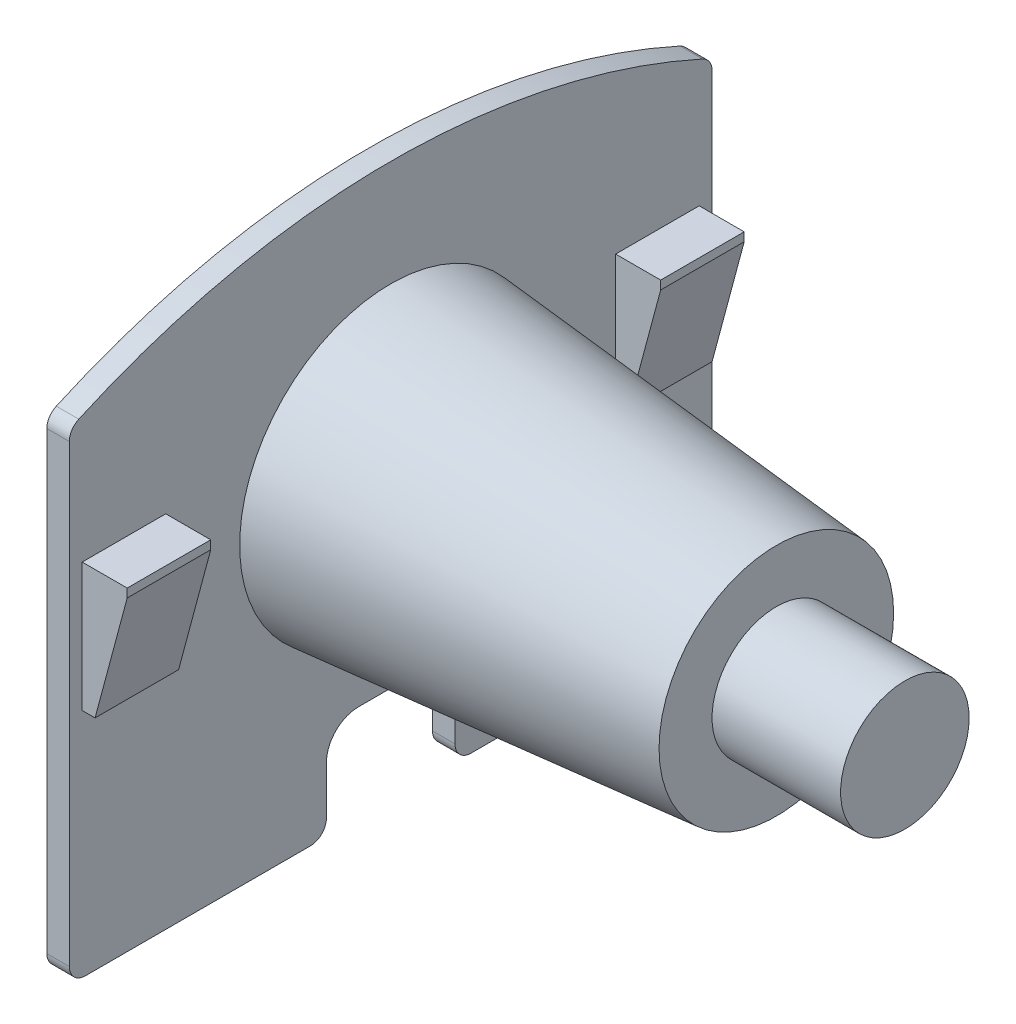
ISO-10303-21;
HEADER;
FILE_DESCRIPTION(('STEP AP214'),'2;1');
FILE_NAME('part.step','',(''),(''),'','','');
FILE_SCHEMA(('AUTOMOTIVE_DESIGN { 1 0 10303 214 1 1 1 1 }'));
ENDSEC;
DATA;
#1=APPLICATION_CONTEXT('core data for automotive mechanical design processes');
#2=APPLICATION_PROTOCOL_DEFINITION('international standard','automotive_design',2000,#1);
#3=PRODUCT_CONTEXT('',#1,'mechanical');
#4=PRODUCT('Part','Part','',(#3));
#5=PRODUCT_RELATED_PRODUCT_CATEGORY('part','',(#4));
#6=PRODUCT_DEFINITION_FORMATION('','',#4);
#7=PRODUCT_DEFINITION_CONTEXT('part definition',#1,'design');
#8=PRODUCT_DEFINITION('design','',#6,#7);
#9=PRODUCT_DEFINITION_SHAPE('','',#8);
#10=(LENGTH_UNIT() NAMED_UNIT(*) SI_UNIT(.MILLI.,.METRE.));
#11=(NAMED_UNIT(*) PLANE_ANGLE_UNIT() SI_UNIT($,.RADIAN.));
#12=(NAMED_UNIT(*) SI_UNIT($,.STERADIAN.) SOLID_ANGLE_UNIT());
#13=UNCERTAINTY_MEASURE_WITH_UNIT(LENGTH_MEASURE(1.E-05),#10,'distance_accuracy_value','');
#14=(GEOMETRIC_REPRESENTATION_CONTEXT(3) GLOBAL_UNCERTAINTY_ASSIGNED_CONTEXT((#13)) GLOBAL_UNIT_ASSIGNED_CONTEXT((#10,
#11,#12)) REPRESENTATION_CONTEXT('',''));
#15=CARTESIAN_POINT('',(0.,0.,0.));
#16=DIRECTION('',(0.,0.,1.));
#17=DIRECTION('',(1.,0.,0.));
#18=AXIS2_PLACEMENT_3D('',#15,#16,#17);
#19=CARTESIAN_POINT('',(6.,0.,0.));
#20=DIRECTION('',(1.,0.,0.));
#21=DIRECTION('',(0.,0.,-1.));
#22=AXIS2_PLACEMENT_3D('',#19,#20,#21);
#23=PLANE('',#22);
#24=CARTESIAN_POINT('',(6.,0.,0.));
#25=DIRECTION('',(1.,0.,0.));
#26=DIRECTION('',(0.,0.,-1.));
#27=AXIS2_PLACEMENT_3D('',#24,#25,#26);
#28=CIRCLE('',#27,1.82506801884446);
#29=CARTESIAN_POINT('',(6.,0.,-1.82506801884446));
#30=VERTEX_POINT('',#29);
#31=EDGE_CURVE('E342',#30,#30,#28,.T.);
#32=ORIENTED_EDGE('',*,*,#31,.T.);
#33=EDGE_LOOP('',(#32));
#34=FACE_BOUND('',#33,.T.);
#35=CARTESIAN_POINT('',(6.,0.,0.));
#36=DIRECTION('',(1.,0.,0.));
#37=DIRECTION('',(0.,0.,-1.));
#38=AXIS2_PLACEMENT_3D('',#35,#36,#37);
#39=CIRCLE('',#38,1.);
#40=CARTESIAN_POINT('',(6.,0.,-1.));
#41=VERTEX_POINT('',#40);
#42=EDGE_CURVE('E43',#41,#41,#39,.F.);
#43=ORIENTED_EDGE('',*,*,#42,.T.);
#44=EDGE_LOOP('',(#43));
#45=FACE_BOUND('',#44,.T.);
#46=ADVANCED_FACE('F39',(#34,#45),#23,.T.);
#47=CARTESIAN_POINT('',(0.,-7.7619550798983,0.));
#48=DIRECTION('',(1.,0.,0.));
#49=DIRECTION('',(0.,0.,-1.));
#50=AXIS2_PLACEMENT_3D('',#47,#48,#49);
#51=PLANE('',#50);
#52=DIRECTION('',(0.,0.,-1.));
#53=VECTOR('',#52,1.);
#54=CARTESIAN_POINT('',(0.,-1.,4.8));
#55=LINE('',#54,#53);
#56=CARTESIAN_POINT('',(0.,-1.,4.8));
#57=VERTEX_POINT('',#56);
#58=CARTESIAN_POINT('',(0.,-1.,3.5));
#59=VERTEX_POINT('',#58);
#60=EDGE_CURVE('E261',#57,#59,#55,.T.);
#61=ORIENTED_EDGE('',*,*,#60,.F.);
#62=DIRECTION('',(0.,-1.,0.));
#63=VECTOR('',#62,1.);
#64=CARTESIAN_POINT('',(0.,0.999999999999999,4.8));
#65=LINE('',#64,#63);
#66=CARTESIAN_POINT('',(0.,0.999999999999999,4.8));
#67=VERTEX_POINT('',#66);
#68=EDGE_CURVE('E256',#67,#57,#65,.T.);
#69=ORIENTED_EDGE('',*,*,#68,.F.);
#70=DIRECTION('',(0.,0.,1.));
#71=VECTOR('',#70,1.);
#72=CARTESIAN_POINT('',(0.,0.999999999999999,4.8));
#73=LINE('',#72,#71);
#74=CARTESIAN_POINT('',(0.,0.999999999999999,3.5));
#75=VERTEX_POINT('',#74);
#76=EDGE_CURVE('E271',#75,#67,#73,.T.);
#77=ORIENTED_EDGE('',*,*,#76,.F.);
#78=DIRECTION('',(0.,1.,0.));
#79=VECTOR('',#78,1.);
#80=CARTESIAN_POINT('',(0.,0.999999999999999,3.5));
#81=LINE('',#80,#79);
#82=EDGE_CURVE('E278',#59,#75,#81,.T.);
#83=ORIENTED_EDGE('',*,*,#82,.F.);
#84=EDGE_LOOP('',(#61,#69,#77,#83));
#85=FACE_BOUND('',#84,.T.);
#86=DIRECTION('',(0.,-1.,0.));
#87=VECTOR('',#86,1.);
#88=CARTESIAN_POINT('',(0.,-4.6,5.));
#89=LINE('',#88,#87);
#90=CARTESIAN_POINT('',(0.,2.72435074062764,5.));
#91=VERTEX_POINT('',#90);
#92=CARTESIAN_POINT('',(0.,-4.35,5.));
#93=VERTEX_POINT('',#92);
#94=EDGE_CURVE('E320',#91,#93,#89,.T.);
#95=ORIENTED_EDGE('',*,*,#94,.T.);
#96=CARTESIAN_POINT('',(0.,-4.35,4.75));
#97=DIRECTION('',(1.,0.,0.));
#98=DIRECTION('',(0.,0.,-1.));
#99=AXIS2_PLACEMENT_3D('',#96,#97,#98);
#100=CIRCLE('',#99,0.25);
#101=CARTESIAN_POINT('',(0.,-4.6,4.75));
#102=VERTEX_POINT('',#101);
#103=EDGE_CURVE('E400',#93,#102,#100,.T.);
#104=ORIENTED_EDGE('',*,*,#103,.T.);
#105=DIRECTION('',(0.,0.,-1.));
#106=VECTOR('',#105,1.);
#107=CARTESIAN_POINT('',(0.,-4.6,5.));
#108=LINE('',#107,#106);
#109=CARTESIAN_POINT('',(0.,-4.6,1.25));
#110=VERTEX_POINT('',#109);
#111=EDGE_CURVE('E323',#102,#110,#108,.T.);
#112=ORIENTED_EDGE('',*,*,#111,.T.);
#113=CARTESIAN_POINT('',(0.,-4.35,1.25));
#114=DIRECTION('',(1.,0.,0.));
#115=DIRECTION('',(0.,0.,-1.));
#116=AXIS2_PLACEMENT_3D('',#113,#114,#115);
#117=CIRCLE('',#116,0.25);
#118=CARTESIAN_POINT('',(0.,-4.35,0.999999999999998));
#119=VERTEX_POINT('',#118);
#120=EDGE_CURVE('E398',#110,#119,#117,.T.);
#121=ORIENTED_EDGE('',*,*,#120,.T.);
#122=DIRECTION('',(0.,1.,0.));
#123=VECTOR('',#122,1.);
#124=CARTESIAN_POINT('',(0.,-4.6,0.999999999999998));
#125=LINE('',#124,#123);
#126=CARTESIAN_POINT('',(0.,-3.6,0.999999999999998));
#127=VERTEX_POINT('',#126);
#128=EDGE_CURVE('E326',#119,#127,#125,.T.);
#129=ORIENTED_EDGE('',*,*,#128,.T.);
#130=CARTESIAN_POINT('',(0.,-3.6,0.499999999999998));
#131=DIRECTION('',(1.,0.,0.));
#132=DIRECTION('',(0.,0.,-1.));
#133=AXIS2_PLACEMENT_3D('',#130,#131,#132);
#134=CIRCLE('',#133,0.5);
#135=CARTESIAN_POINT('',(0.,-3.1,0.499999999999998));
#136=VERTEX_POINT('',#135);
#137=EDGE_CURVE('E379',#127,#136,#134,.F.);
#138=ORIENTED_EDGE('',*,*,#137,.T.);
#139=DIRECTION('',(0.,0.,-1.));
#140=VECTOR('',#139,1.);
#141=CARTESIAN_POINT('',(0.,-3.1,0.999999999999998));
#142=LINE('',#141,#140);
#143=CARTESIAN_POINT('',(0.,-3.1,-0.500000000000002));
#144=VERTEX_POINT('',#143);
#145=EDGE_CURVE('E328',#136,#144,#142,.T.);
#146=ORIENTED_EDGE('',*,*,#145,.T.);
#147=CARTESIAN_POINT('',(0.,-3.6,-0.500000000000002));
#148=DIRECTION('',(1.,0.,0.));
#149=DIRECTION('',(0.,0.,-1.));
#150=AXIS2_PLACEMENT_3D('',#147,#148,#149);
#151=CIRCLE('',#150,0.5);
#152=CARTESIAN_POINT('',(0.,-3.6,-1.));
#153=VERTEX_POINT('',#152);
#154=EDGE_CURVE('E375',#144,#153,#151,.F.);
#155=ORIENTED_EDGE('',*,*,#154,.T.);
#156=DIRECTION('',(0.,-1.,0.));
#157=VECTOR('',#156,1.);
#158=CARTESIAN_POINT('',(0.,-4.6,-1.));
#159=LINE('',#158,#157);
#160=CARTESIAN_POINT('',(0.,-4.35,-1.));
#161=VERTEX_POINT('',#160);
#162=EDGE_CURVE('E331',#153,#161,#159,.T.);
#163=ORIENTED_EDGE('',*,*,#162,.T.);
#164=CARTESIAN_POINT('',(0.,-4.35,-1.25));
#165=DIRECTION('',(1.,0.,0.));
#166=DIRECTION('',(0.,0.,-1.));
#167=AXIS2_PLACEMENT_3D('',#164,#165,#166);
#168=CIRCLE('',#167,0.25);
#169=CARTESIAN_POINT('',(0.,-4.6,-1.25));
#170=VERTEX_POINT('',#169);
#171=EDGE_CURVE('E396',#161,#170,#168,.T.);
#172=ORIENTED_EDGE('',*,*,#171,.T.);
#173=DIRECTION('',(0.,0.,-1.));
#174=VECTOR('',#173,1.);
#175=CARTESIAN_POINT('',(0.,-4.6,-1.));
#176=LINE('',#175,#174);
#177=CARTESIAN_POINT('',(0.,-4.6,-4.75));
#178=VERTEX_POINT('',#177);
#179=EDGE_CURVE('E334',#170,#178,#176,.T.);
#180=ORIENTED_EDGE('',*,*,#179,.T.);
#181=CARTESIAN_POINT('',(0.,-4.35,-4.75));
#182=DIRECTION('',(1.,0.,0.));
#183=DIRECTION('',(0.,0.,-1.));
#184=AXIS2_PLACEMENT_3D('',#181,#182,#183);
#185=CIRCLE('',#184,0.25);
#186=CARTESIAN_POINT('',(0.,-4.35,-5.));
#187=VERTEX_POINT('',#186);
#188=EDGE_CURVE('E394',#178,#187,#185,.T.);
#189=ORIENTED_EDGE('',*,*,#188,.T.);
#190=DIRECTION('',(0.,1.,0.));
#191=VECTOR('',#190,1.);
#192=CARTESIAN_POINT('',(0.,-4.6,-5.));
#193=LINE('',#192,#191);
#194=CARTESIAN_POINT('',(0.,2.72435074062764,-5.));
#195=VERTEX_POINT('',#194);
#196=EDGE_CURVE('E296',#187,#195,#193,.T.);
#197=ORIENTED_EDGE('',*,*,#196,.T.);
#198=CARTESIAN_POINT('',(0.,2.72435074062764,-4.75));
#199=DIRECTION('',(1.,0.,0.));
#200=DIRECTION('',(0.,0.,-1.));
#201=AXIS2_PLACEMENT_3D('',#198,#199,#200);
#202=CIRCLE('',#201,0.25);
#203=CARTESIAN_POINT('',(0.,2.95207717257917,-4.85315363391867));
#204=VERTEX_POINT('',#203);
#205=EDGE_CURVE('E391',#195,#204,#202,.T.);
#206=ORIENTED_EDGE('',*,*,#205,.T.);
#207=CARTESIAN_POINT('',(0.,-7.7619550798983,0.));
#208=DIRECTION('',(1.,0.,0.));
#209=DIRECTION('',(0.,0.,-1.));
#210=AXIS2_PLACEMENT_3D('',#207,#208,#209);
#211=CIRCLE('',#210,11.7619550798983);
#212=CARTESIAN_POINT('',(0.,2.95207717257917,4.85315363391867));
#213=VERTEX_POINT('',#212);
#214=EDGE_CURVE('E290',#204,#213,#211,.T.);
#215=ORIENTED_EDGE('',*,*,#214,.T.);
#216=CARTESIAN_POINT('',(0.,2.72435074062764,4.75));
#217=DIRECTION('',(1.,0.,0.));
#218=DIRECTION('',(0.,0.,-1.));
#219=AXIS2_PLACEMENT_3D('',#216,#217,#218);
#220=CIRCLE('',#219,0.25);
#221=EDGE_CURVE('E389',#213,#91,#220,.T.);
#222=ORIENTED_EDGE('',*,*,#221,.T.);
#223=EDGE_LOOP('',(#95,#104,#112,#121,#129,#138,#146,#155,#163,#172,#180,#189,#197,#206,#215,#222));
#224=FACE_BOUND('',#223,.T.);
#225=CARTESIAN_POINT('',(0.,0.,0.));
#226=DIRECTION('',(1.,0.,0.));
#227=DIRECTION('',(0.,0.,-1.));
#228=AXIS2_PLACEMENT_3D('',#225,#226,#227);
#229=CIRCLE('',#228,2.35);
#230=CARTESIAN_POINT('',(0.,0.,-2.35));
#231=VERTEX_POINT('',#230);
#232=EDGE_CURVE('E316',#231,#231,#229,.T.);
#233=ORIENTED_EDGE('',*,*,#232,.F.);
#234=EDGE_LOOP('',(#233));
#235=FACE_BOUND('',#234,.T.);
#236=DIRECTION('',(0.,-1.,0.));
#237=VECTOR('',#236,1.);
#238=CARTESIAN_POINT('',(0.,0.999999999999998,-3.5));
#239=LINE('',#238,#237);
#240=CARTESIAN_POINT('',(0.,0.999999999999998,-3.5));
#241=VERTEX_POINT('',#240);
#242=CARTESIAN_POINT('',(0.,-1.,-3.5));
#243=VERTEX_POINT('',#242);
#244=EDGE_CURVE('E839',#241,#243,#239,.T.);
#245=ORIENTED_EDGE('',*,*,#244,.F.);
#246=DIRECTION('',(0.,0.,1.));
#247=VECTOR('',#246,1.);
#248=CARTESIAN_POINT('',(0.,0.999999999999998,-4.8));
#249=LINE('',#248,#247);
#250=CARTESIAN_POINT('',(0.,0.999999999999998,-4.8));
#251=VERTEX_POINT('',#250);
#252=EDGE_CURVE('E253',#251,#241,#249,.T.);
#253=ORIENTED_EDGE('',*,*,#252,.F.);
#254=DIRECTION('',(0.,1.,0.));
#255=VECTOR('',#254,1.);
#256=CARTESIAN_POINT('',(0.,0.999999999999998,-4.8));
#257=LINE('',#256,#255);
#258=CARTESIAN_POINT('',(0.,-1.,-4.8));
#259=VERTEX_POINT('',#258);
#260=EDGE_CURVE('E249',#259,#251,#257,.T.);
#261=ORIENTED_EDGE('',*,*,#260,.F.);
#262=DIRECTION('',(0.,0.,-1.));
#263=VECTOR('',#262,1.);
#264=CARTESIAN_POINT('',(0.,-1.,-4.8));
#265=LINE('',#264,#263);
#266=EDGE_CURVE('E828',#243,#259,#265,.T.);
#267=ORIENTED_EDGE('',*,*,#266,.F.);
#268=EDGE_LOOP('',(#245,#253,#261,#267));
#269=FACE_BOUND('',#268,.T.);
#270=ADVANCED_FACE('F440',(#85,#224,#235,#269),#51,.T.);
#271=CARTESIAN_POINT('',(0.,0.,0.));
#272=DIRECTION('',(-1.,0.,0.));
#273=DIRECTION('',(0.,0.,-1.));
#274=AXIS2_PLACEMENT_3D('',#271,#272,#273);
#275=CONICAL_SURFACE('',#274,2.35,0.0872664625997167);
#276=ORIENTED_EDGE('',*,*,#31,.F.);
#277=EDGE_LOOP('',(#276));
#278=FACE_BOUND('',#277,.T.);
#279=ORIENTED_EDGE('',*,*,#232,.T.);
#280=EDGE_LOOP('',(#279));
#281=FACE_BOUND('',#280,.T.);
#282=ADVANCED_FACE('F521',(#278,#281),#275,.T.);
#283=CARTESIAN_POINT('',(-0.35,-4.6,-5.));
#284=DIRECTION('',(0.,0.,-1.));
#285=DIRECTION('',(-1.,0.,0.));
#286=AXIS2_PLACEMENT_3D('',#283,#284,#285);
#287=PLANE('',#286);
#288=ORIENTED_EDGE('',*,*,#196,.F.);
#289=DIRECTION('',(1.,0.,0.));
#290=VECTOR('',#289,1.);
#291=CARTESIAN_POINT('',(-0.35,-4.35,-5.));
#292=LINE('',#291,#290);
#293=CARTESIAN_POINT('',(-0.35,-4.35,-5.));
#294=VERTEX_POINT('',#293);
#295=EDGE_CURVE('E433',#187,#294,#292,.F.);
#296=ORIENTED_EDGE('',*,*,#295,.T.);
#297=DIRECTION('',(0.,1.,0.));
#298=VECTOR('',#297,1.);
#299=CARTESIAN_POINT('',(-0.35,2.49538194882667,-5.));
#300=LINE('',#299,#298);
#301=CARTESIAN_POINT('',(-0.35,2.72435074062764,-5.));
#302=VERTEX_POINT('',#301);
#303=EDGE_CURVE('E291',#294,#302,#300,.T.);
#304=ORIENTED_EDGE('',*,*,#303,.T.);
#305=DIRECTION('',(1.,0.,0.));
#306=VECTOR('',#305,1.);
#307=CARTESIAN_POINT('',(-0.35,2.72435074062764,-5.));
#308=LINE('',#307,#306);
#309=EDGE_CURVE('E429',#302,#195,#308,.T.);
#310=ORIENTED_EDGE('',*,*,#309,.T.);
#311=EDGE_LOOP('',(#288,#296,#304,#310));
#312=FACE_BOUND('',#311,.T.);
#313=ADVANCED_FACE('F449',(#312),#287,.T.);
#314=CARTESIAN_POINT('',(-0.35,-4.6,-1.));
#315=DIRECTION('',(0.,-1.,0.));
#316=DIRECTION('',(0.,0.,-1.));
#317=AXIS2_PLACEMENT_3D('',#314,#315,#316);
#318=PLANE('',#317);
#319=ORIENTED_EDGE('',*,*,#179,.F.);
#320=DIRECTION('',(1.,0.,0.));
#321=VECTOR('',#320,1.);
#322=CARTESIAN_POINT('',(-0.35,-4.6,-1.25));
#323=LINE('',#322,#321);
#324=CARTESIAN_POINT('',(-0.35,-4.6,-1.25));
#325=VERTEX_POINT('',#324);
#326=EDGE_CURVE('E427',#170,#325,#323,.F.);
#327=ORIENTED_EDGE('',*,*,#326,.T.);
#328=DIRECTION('',(0.,0.,-1.));
#329=VECTOR('',#328,1.);
#330=CARTESIAN_POINT('',(-0.35,-4.6,-1.));
#331=LINE('',#330,#329);
#332=CARTESIAN_POINT('',(-0.35,-4.6,-4.75));
#333=VERTEX_POINT('',#332);
#334=EDGE_CURVE('E313',#325,#333,#331,.T.);
#335=ORIENTED_EDGE('',*,*,#334,.T.);
#336=DIRECTION('',(1.,0.,0.));
#337=VECTOR('',#336,1.);
#338=CARTESIAN_POINT('',(-0.35,-4.6,-4.75));
#339=LINE('',#338,#337);
#340=EDGE_CURVE('E424',#333,#178,#339,.T.);
#341=ORIENTED_EDGE('',*,*,#340,.T.);
#342=EDGE_LOOP('',(#319,#327,#335,#341));
#343=FACE_BOUND('',#342,.T.);
#344=ADVANCED_FACE('F461',(#343),#318,.T.);
#345=CARTESIAN_POINT('',(-0.35,-4.6,-1.));
#346=DIRECTION('',(0.,0.,1.));
#347=DIRECTION('',(1.,0.,0.));
#348=AXIS2_PLACEMENT_3D('',#345,#346,#347);
#349=PLANE('',#348);
#350=DIRECTION('',(0.,-1.,0.));
#351=VECTOR('',#350,1.);
#352=CARTESIAN_POINT('',(-0.35,-4.6,-1.));
#353=LINE('',#352,#351);
#354=CARTESIAN_POINT('',(-0.35,-3.6,-1.));
#355=VERTEX_POINT('',#354);
#356=CARTESIAN_POINT('',(-0.35,-4.35,-1.));
#357=VERTEX_POINT('',#356);
#358=EDGE_CURVE('E310',#355,#357,#353,.T.);
#359=ORIENTED_EDGE('',*,*,#358,.T.);
#360=DIRECTION('',(1.,0.,0.));
#361=VECTOR('',#360,1.);
#362=CARTESIAN_POINT('',(-0.35,-4.35,-1.));
#363=LINE('',#362,#361);
#364=EDGE_CURVE('E421',#357,#161,#363,.T.);
#365=ORIENTED_EDGE('',*,*,#364,.T.);
#366=ORIENTED_EDGE('',*,*,#162,.F.);
#367=DIRECTION('',(1.,0.,0.));
#368=VECTOR('',#367,1.);
#369=CARTESIAN_POINT('',(-0.35,-3.6,-1.));
#370=LINE('',#369,#368);
#371=EDGE_CURVE('E370',#153,#355,#370,.F.);
#372=ORIENTED_EDGE('',*,*,#371,.T.);
#373=EDGE_LOOP('',(#359,#365,#366,#372));
#374=FACE_BOUND('',#373,.T.);
#375=ADVANCED_FACE('F469',(#374),#349,.T.);
#376=CARTESIAN_POINT('',(-0.35,-3.1,0.999999999999998));
#377=DIRECTION('',(0.,-1.,0.));
#378=DIRECTION('',(0.,0.,-1.));
#379=AXIS2_PLACEMENT_3D('',#376,#377,#378);
#380=PLANE('',#379);
#381=DIRECTION('',(0.,0.,-1.));
#382=VECTOR('',#381,1.);
#383=CARTESIAN_POINT('',(-0.35,-3.1,0.999999999999998));
#384=LINE('',#383,#382);
#385=CARTESIAN_POINT('',(-0.35,-3.1,0.499999999999998));
#386=VERTEX_POINT('',#385);
#387=CARTESIAN_POINT('',(-0.35,-3.1,-0.500000000000002));
#388=VERTEX_POINT('',#387);
#389=EDGE_CURVE('E307',#386,#388,#384,.T.);
#390=ORIENTED_EDGE('',*,*,#389,.T.);
#391=DIRECTION('',(1.,0.,0.));
#392=VECTOR('',#391,1.);
#393=CARTESIAN_POINT('',(0.,-3.1,-0.500000000000002));
#394=LINE('',#393,#392);
#395=EDGE_CURVE('E367',#388,#144,#394,.T.);
#396=ORIENTED_EDGE('',*,*,#395,.T.);
#397=ORIENTED_EDGE('',*,*,#145,.F.);
#398=DIRECTION('',(1.,0.,0.));
#399=VECTOR('',#398,1.);
#400=CARTESIAN_POINT('',(-0.35,-3.1,0.499999999999998));
#401=LINE('',#400,#399);
#402=EDGE_CURVE('E365',#136,#386,#401,.F.);
#403=ORIENTED_EDGE('',*,*,#402,.T.);
#404=EDGE_LOOP('',(#390,#396,#397,#403));
#405=FACE_BOUND('',#404,.T.);
#406=ADVANCED_FACE('F479',(#405),#380,.T.);
#407=CARTESIAN_POINT('',(-0.35,-4.6,0.999999999999998));
#408=DIRECTION('',(0.,0.,-1.));
#409=DIRECTION('',(-1.,0.,0.));
#410=AXIS2_PLACEMENT_3D('',#407,#408,#409);
#411=PLANE('',#410);
#412=ORIENTED_EDGE('',*,*,#128,.F.);
#413=DIRECTION('',(1.,0.,0.));
#414=VECTOR('',#413,1.);
#415=CARTESIAN_POINT('',(-0.35,-4.35,0.999999999999998));
#416=LINE('',#415,#414);
#417=CARTESIAN_POINT('',(-0.35,-4.35,0.999999999999998));
#418=VERTEX_POINT('',#417);
#419=EDGE_CURVE('E419',#119,#418,#416,.F.);
#420=ORIENTED_EDGE('',*,*,#419,.T.);
#421=DIRECTION('',(0.,1.,0.));
#422=VECTOR('',#421,1.);
#423=CARTESIAN_POINT('',(-0.35,-4.6,0.999999999999998));
#424=LINE('',#423,#422);
#425=CARTESIAN_POINT('',(-0.35,-3.6,0.999999999999998));
#426=VERTEX_POINT('',#425);
#427=EDGE_CURVE('E305',#418,#426,#424,.T.);
#428=ORIENTED_EDGE('',*,*,#427,.T.);
#429=DIRECTION('',(1.,0.,0.));
#430=VECTOR('',#429,1.);
#431=CARTESIAN_POINT('',(0.,-3.6,0.999999999999998));
#432=LINE('',#431,#430);
#433=EDGE_CURVE('E372',#426,#127,#432,.T.);
#434=ORIENTED_EDGE('',*,*,#433,.T.);
#435=EDGE_LOOP('',(#412,#420,#428,#434));
#436=FACE_BOUND('',#435,.T.);
#437=ADVANCED_FACE('F488',(#436),#411,.T.);
#438=CARTESIAN_POINT('',(-0.35,-4.6,5.));
#439=DIRECTION('',(0.,-1.,0.));
#440=DIRECTION('',(0.,0.,-1.));
#441=AXIS2_PLACEMENT_3D('',#438,#439,#440);
#442=PLANE('',#441);
#443=ORIENTED_EDGE('',*,*,#111,.F.);
#444=DIRECTION('',(1.,0.,0.));
#445=VECTOR('',#444,1.);
#446=CARTESIAN_POINT('',(-0.35,-4.6,4.75));
#447=LINE('',#446,#445);
#448=CARTESIAN_POINT('',(-0.35,-4.6,4.75));
#449=VERTEX_POINT('',#448);
#450=EDGE_CURVE('E405',#102,#449,#447,.F.);
#451=ORIENTED_EDGE('',*,*,#450,.T.);
#452=DIRECTION('',(0.,0.,-1.));
#453=VECTOR('',#452,1.);
#454=CARTESIAN_POINT('',(-0.35,-4.6,5.));
#455=LINE('',#454,#453);
#456=CARTESIAN_POINT('',(-0.35,-4.6,1.25));
#457=VERTEX_POINT('',#456);
#458=EDGE_CURVE('E302',#449,#457,#455,.T.);
#459=ORIENTED_EDGE('',*,*,#458,.T.);
#460=DIRECTION('',(1.,0.,0.));
#461=VECTOR('',#460,1.);
#462=CARTESIAN_POINT('',(-0.35,-4.6,1.25));
#463=LINE('',#462,#461);
#464=EDGE_CURVE('E402',#457,#110,#463,.T.);
#465=ORIENTED_EDGE('',*,*,#464,.T.);
#466=EDGE_LOOP('',(#443,#451,#459,#465));
#467=FACE_BOUND('',#466,.T.);
#468=ADVANCED_FACE('F497',(#467),#442,.T.);
#469=CARTESIAN_POINT('',(-0.35,-4.6,5.));
#470=DIRECTION('',(0.,0.,1.));
#471=DIRECTION('',(1.,0.,0.));
#472=AXIS2_PLACEMENT_3D('',#469,#470,#471);
#473=PLANE('',#472);
#474=DIRECTION('',(0.,-1.,0.));
#475=VECTOR('',#474,1.);
#476=CARTESIAN_POINT('',(-0.35,2.49538194882667,5.));
#477=LINE('',#476,#475);
#478=CARTESIAN_POINT('',(-0.35,2.72435074062764,5.));
#479=VERTEX_POINT('',#478);
#480=CARTESIAN_POINT('',(-0.35,-4.35,5.));
#481=VERTEX_POINT('',#480);
#482=EDGE_CURVE('E299',#479,#481,#477,.T.);
#483=ORIENTED_EDGE('',*,*,#482,.T.);
#484=DIRECTION('',(1.,0.,0.));
#485=VECTOR('',#484,1.);
#486=CARTESIAN_POINT('',(-0.35,-4.35,5.));
#487=LINE('',#486,#485);
#488=EDGE_CURVE('E386',#481,#93,#487,.T.);
#489=ORIENTED_EDGE('',*,*,#488,.T.);
#490=ORIENTED_EDGE('',*,*,#94,.F.);
#491=DIRECTION('',(1.,0.,0.));
#492=VECTOR('',#491,1.);
#493=CARTESIAN_POINT('',(-0.35,2.72435074062764,5.));
#494=LINE('',#493,#492);
#495=EDGE_CURVE('E384',#91,#479,#494,.F.);
#496=ORIENTED_EDGE('',*,*,#495,.T.);
#497=EDGE_LOOP('',(#483,#489,#490,#496));
#498=FACE_BOUND('',#497,.T.);
#499=ADVANCED_FACE('F504',(#498),#473,.T.);
#500=CARTESIAN_POINT('',(-0.35,-7.7619550798983,0.));
#501=DIRECTION('',(1.,0.,0.));
#502=DIRECTION('',(0.,0.,-1.));
#503=AXIS2_PLACEMENT_3D('',#500,#501,#502);
#504=CYLINDRICAL_SURFACE('',#503,11.7619550798983);
#505=ORIENTED_EDGE('',*,*,#214,.F.);
#506=DIRECTION('',(1.,0.,0.));
#507=VECTOR('',#506,1.);
#508=CARTESIAN_POINT('',(-0.35,2.95207717257917,-4.85315363391867));
#509=LINE('',#508,#507);
#510=CARTESIAN_POINT('',(-0.35,2.95207717257917,-4.85315363391867));
#511=VERTEX_POINT('',#510);
#512=EDGE_CURVE('E11',#204,#511,#509,.F.);
#513=ORIENTED_EDGE('',*,*,#512,.T.);
#514=CARTESIAN_POINT('',(-0.35,-7.7619550798983,0.));
#515=DIRECTION('',(1.,0.,0.));
#516=DIRECTION('',(0.,0.,-1.));
#517=AXIS2_PLACEMENT_3D('',#514,#515,#516);
#518=CIRCLE('',#517,11.7619550798983);
#519=CARTESIAN_POINT('',(-0.35,2.95207717257917,4.85315363391867));
#520=VERTEX_POINT('',#519);
#521=EDGE_CURVE('E295',#511,#520,#518,.T.);
#522=ORIENTED_EDGE('',*,*,#521,.T.);
#523=DIRECTION('',(1.,0.,0.));
#524=VECTOR('',#523,1.);
#525=CARTESIAN_POINT('',(-0.35,2.95207717257917,4.85315363391867));
#526=LINE('',#525,#524);
#527=EDGE_CURVE('E49',#520,#213,#526,.T.);
#528=ORIENTED_EDGE('',*,*,#527,.T.);
#529=EDGE_LOOP('',(#505,#513,#522,#528));
#530=FACE_BOUND('',#529,.T.);
#531=ADVANCED_FACE('F437',(#530),#504,.T.);
#532=CARTESIAN_POINT('',(-0.35,-7.7619550798983,0.));
#533=DIRECTION('',(1.,0.,0.));
#534=DIRECTION('',(0.,0.,-1.));
#535=AXIS2_PLACEMENT_3D('',#532,#533,#534);
#536=PLANE('',#535);
#537=ORIENTED_EDGE('',*,*,#458,.F.);
#538=CARTESIAN_POINT('',(-0.35,-4.35,4.75));
#539=DIRECTION('',(1.,0.,0.));
#540=DIRECTION('',(0.,0.,-1.));
#541=AXIS2_PLACEMENT_3D('',#538,#539,#540);
#542=CIRCLE('',#541,0.25);
#543=EDGE_CURVE('E417',#449,#481,#542,.F.);
#544=ORIENTED_EDGE('',*,*,#543,.T.);
#545=ORIENTED_EDGE('',*,*,#482,.F.);
#546=CARTESIAN_POINT('',(-0.35,2.72435074062764,4.75));
#547=DIRECTION('',(1.,0.,0.));
#548=DIRECTION('',(0.,0.,-1.));
#549=AXIS2_PLACEMENT_3D('',#546,#547,#548);
#550=CIRCLE('',#549,0.25);
#551=EDGE_CURVE('E56',#479,#520,#550,.F.);
#552=ORIENTED_EDGE('',*,*,#551,.T.);
#553=ORIENTED_EDGE('',*,*,#521,.F.);
#554=CARTESIAN_POINT('',(-0.35,2.72435074062764,-4.75));
#555=DIRECTION('',(1.,0.,0.));
#556=DIRECTION('',(0.,0.,-1.));
#557=AXIS2_PLACEMENT_3D('',#554,#555,#556);
#558=CIRCLE('',#557,0.25);
#559=EDGE_CURVE('E408',#511,#302,#558,.F.);
#560=ORIENTED_EDGE('',*,*,#559,.T.);
#561=ORIENTED_EDGE('',*,*,#303,.F.);
#562=CARTESIAN_POINT('',(-0.35,-4.35,-4.75));
#563=DIRECTION('',(1.,0.,0.));
#564=DIRECTION('',(0.,0.,-1.));
#565=AXIS2_PLACEMENT_3D('',#562,#563,#564);
#566=CIRCLE('',#565,0.25);
#567=EDGE_CURVE('E411',#294,#333,#566,.F.);
#568=ORIENTED_EDGE('',*,*,#567,.T.);
#569=ORIENTED_EDGE('',*,*,#334,.F.);
#570=CARTESIAN_POINT('',(-0.35,-4.35,-1.25));
#571=DIRECTION('',(1.,0.,0.));
#572=DIRECTION('',(0.,0.,-1.));
#573=AXIS2_PLACEMENT_3D('',#570,#571,#572);
#574=CIRCLE('',#573,0.25);
#575=EDGE_CURVE('E413',#325,#357,#574,.F.);
#576=ORIENTED_EDGE('',*,*,#575,.T.);
#577=ORIENTED_EDGE('',*,*,#358,.F.);
#578=CARTESIAN_POINT('',(-0.35,-3.6,-0.500000000000002));
#579=DIRECTION('',(1.,0.,0.));
#580=DIRECTION('',(0.,0.,-1.));
#581=AXIS2_PLACEMENT_3D('',#578,#579,#580);
#582=CIRCLE('',#581,0.5);
#583=EDGE_CURVE('E377',#355,#388,#582,.T.);
#584=ORIENTED_EDGE('',*,*,#583,.T.);
#585=ORIENTED_EDGE('',*,*,#389,.F.);
#586=CARTESIAN_POINT('',(-0.35,-3.6,0.499999999999998));
#587=DIRECTION('',(1.,0.,0.));
#588=DIRECTION('',(0.,0.,-1.));
#589=AXIS2_PLACEMENT_3D('',#586,#587,#588);
#590=CIRCLE('',#589,0.5);
#591=EDGE_CURVE('E381',#386,#426,#590,.T.);
#592=ORIENTED_EDGE('',*,*,#591,.T.);
#593=ORIENTED_EDGE('',*,*,#427,.F.);
#594=CARTESIAN_POINT('',(-0.35,-4.35,1.25));
#595=DIRECTION('',(1.,0.,0.));
#596=DIRECTION('',(0.,0.,-1.));
#597=AXIS2_PLACEMENT_3D('',#594,#595,#596);
#598=CIRCLE('',#597,0.25);
#599=EDGE_CURVE('E415',#418,#457,#598,.F.);
#600=ORIENTED_EDGE('',*,*,#599,.T.);
#601=EDGE_LOOP('',(#537,#544,#545,#552,#553,#560,#561,#568,#569,#576,#577,#584,#585,#592,#593,#600));
#602=FACE_BOUND('',#601,.T.);
#603=ADVANCED_FACE('F454',(#602),#536,.F.);
#604=CARTESIAN_POINT('',(0.7,0.999999999999999,4.8));
#605=DIRECTION('',(0.,0.,-1.));
#606=DIRECTION('',(-1.,0.,0.));
#607=AXIS2_PLACEMENT_3D('',#604,#605,#606);
#608=PLANE('',#607);
#609=DIRECTION('',(-1.,0.,0.));
#610=VECTOR('',#609,1.);
#611=CARTESIAN_POINT('',(0.7,-1.,4.8));
#612=LINE('',#611,#610);
#613=CARTESIAN_POINT('',(0.199999999999999,-1.,4.8));
#614=VERTEX_POINT('',#613);
#615=EDGE_CURVE('E288',#614,#57,#612,.T.);
#616=ORIENTED_EDGE('',*,*,#615,.F.);
#617=DIRECTION('',(0.258819045102521,0.965925826289068,0.));
#618=VECTOR('',#617,1.);
#619=CARTESIAN_POINT('',(0.7,0.866025403784436,4.8));
#620=LINE('',#619,#618);
#621=CARTESIAN_POINT('',(0.7,0.866025403784436,4.8));
#622=VERTEX_POINT('',#621);
#623=EDGE_CURVE('E363',#614,#622,#620,.T.);
#624=ORIENTED_EDGE('',*,*,#623,.T.);
#625=DIRECTION('',(0.,-1.,0.));
#626=VECTOR('',#625,1.);
#627=CARTESIAN_POINT('',(0.7,0.999999999999999,4.8));
#628=LINE('',#627,#626);
#629=CARTESIAN_POINT('',(0.7,0.999999999999999,4.8));
#630=VERTEX_POINT('',#629);
#631=EDGE_CURVE('E267',#630,#622,#628,.T.);
#632=ORIENTED_EDGE('',*,*,#631,.F.);
#633=DIRECTION('',(-1.,0.,0.));
#634=VECTOR('',#633,1.);
#635=CARTESIAN_POINT('',(0.7,0.999999999999999,4.8));
#636=LINE('',#635,#634);
#637=EDGE_CURVE('E274',#630,#67,#636,.T.);
#638=ORIENTED_EDGE('',*,*,#637,.T.);
#639=ORIENTED_EDGE('',*,*,#68,.T.);
#640=EDGE_LOOP('',(#616,#624,#632,#638,#639));
#641=FACE_BOUND('',#640,.T.);
#642=ADVANCED_FACE('F616',(#641),#608,.F.);
#643=CARTESIAN_POINT('',(0.7,-1.,4.8));
#644=DIRECTION('',(0.,1.,0.));
#645=DIRECTION('',(0.,0.,1.));
#646=AXIS2_PLACEMENT_3D('',#643,#644,#645);
#647=PLANE('',#646);
#648=DIRECTION('',(-1.,0.,0.));
#649=VECTOR('',#648,1.);
#650=CARTESIAN_POINT('',(0.7,-1.,3.5));
#651=LINE('',#650,#649);
#652=CARTESIAN_POINT('',(0.199999999999999,-1.,3.5));
#653=VERTEX_POINT('',#652);
#654=EDGE_CURVE('E286',#653,#59,#651,.T.);
#655=ORIENTED_EDGE('',*,*,#654,.F.);
#656=DIRECTION('',(0.,0.,1.));
#657=VECTOR('',#656,1.);
#658=CARTESIAN_POINT('',(0.199999999999999,-1.,4.8));
#659=LINE('',#658,#657);
#660=EDGE_CURVE('E361',#653,#614,#659,.T.);
#661=ORIENTED_EDGE('',*,*,#660,.T.);
#662=ORIENTED_EDGE('',*,*,#615,.T.);
#663=ORIENTED_EDGE('',*,*,#60,.T.);
#664=EDGE_LOOP('',(#655,#661,#662,#663));
#665=FACE_BOUND('',#664,.T.);
#666=ADVANCED_FACE('F612',(#665),#647,.F.);
#667=CARTESIAN_POINT('',(0.7,0.999999999999999,3.5));
#668=DIRECTION('',(0.,0.,1.));
#669=DIRECTION('',(0.,-1.,0.));
#670=AXIS2_PLACEMENT_3D('',#667,#668,#669);
#671=PLANE('',#670);
#672=DIRECTION('',(0.,1.,0.));
#673=VECTOR('',#672,1.);
#674=CARTESIAN_POINT('',(0.7,0.999999999999999,3.5));
#675=LINE('',#674,#673);
#676=CARTESIAN_POINT('',(0.7,0.866025403784436,3.5));
#677=VERTEX_POINT('',#676);
#678=CARTESIAN_POINT('',(0.7,0.999999999999999,3.5));
#679=VERTEX_POINT('',#678);
#680=EDGE_CURVE('E270',#677,#679,#675,.T.);
#681=ORIENTED_EDGE('',*,*,#680,.F.);
#682=DIRECTION('',(-0.258819045102521,-0.965925826289068,0.));
#683=VECTOR('',#682,1.);
#684=CARTESIAN_POINT('',(0.7,0.866025403784436,3.5));
#685=LINE('',#684,#683);
#686=EDGE_CURVE('E359',#677,#653,#685,.T.);
#687=ORIENTED_EDGE('',*,*,#686,.T.);
#688=ORIENTED_EDGE('',*,*,#654,.T.);
#689=ORIENTED_EDGE('',*,*,#82,.T.);
#690=DIRECTION('',(-1.,0.,0.));
#691=VECTOR('',#690,1.);
#692=CARTESIAN_POINT('',(0.7,0.999999999999999,3.5));
#693=LINE('',#692,#691);
#694=EDGE_CURVE('E284',#679,#75,#693,.T.);
#695=ORIENTED_EDGE('',*,*,#694,.F.);
#696=EDGE_LOOP('',(#681,#687,#688,#689,#695));
#697=FACE_BOUND('',#696,.T.);
#698=ADVANCED_FACE('F608',(#697),#671,.F.);
#699=CARTESIAN_POINT('',(0.7,0.999999999999999,4.8));
#700=DIRECTION('',(0.,-1.,0.));
#701=DIRECTION('',(0.,0.,-1.));
#702=AXIS2_PLACEMENT_3D('',#699,#700,#701);
#703=PLANE('',#702);
#704=ORIENTED_EDGE('',*,*,#76,.T.);
#705=ORIENTED_EDGE('',*,*,#637,.F.);
#706=DIRECTION('',(0.,0.,1.));
#707=VECTOR('',#706,1.);
#708=CARTESIAN_POINT('',(0.7,0.999999999999999,4.8));
#709=LINE('',#708,#707);
#710=EDGE_CURVE('E273',#679,#630,#709,.T.);
#711=ORIENTED_EDGE('',*,*,#710,.F.);
#712=ORIENTED_EDGE('',*,*,#694,.T.);
#713=EDGE_LOOP('',(#704,#705,#711,#712));
#714=FACE_BOUND('',#713,.T.);
#715=ADVANCED_FACE('F604',(#714),#703,.F.);
#716=CARTESIAN_POINT('',(0.7,0.,0.));
#717=DIRECTION('',(1.,0.,0.));
#718=DIRECTION('',(0.,0.,-1.));
#719=AXIS2_PLACEMENT_3D('',#716,#717,#718);
#720=PLANE('',#719);
#721=ORIENTED_EDGE('',*,*,#631,.T.);
#722=DIRECTION('',(0.,0.,-1.));
#723=VECTOR('',#722,1.);
#724=CARTESIAN_POINT('',(0.7,0.866025403784436,3.5));
#725=LINE('',#724,#723);
#726=EDGE_CURVE('E356',#622,#677,#725,.T.);
#727=ORIENTED_EDGE('',*,*,#726,.T.);
#728=ORIENTED_EDGE('',*,*,#680,.T.);
#729=ORIENTED_EDGE('',*,*,#710,.T.);
#730=EDGE_LOOP('',(#721,#727,#728,#729));
#731=FACE_BOUND('',#730,.T.);
#732=ADVANCED_FACE('F601',(#731),#720,.T.);
#733=CARTESIAN_POINT('',(0.7,0.999999999999998,-4.8));
#734=DIRECTION('',(0.,-1.,0.));
#735=DIRECTION('',(0.,0.,-1.));
#736=AXIS2_PLACEMENT_3D('',#733,#734,#735);
#737=PLANE('',#736);
#738=ORIENTED_EDGE('',*,*,#252,.T.);
#739=DIRECTION('',(-1.,0.,0.));
#740=VECTOR('',#739,1.);
#741=CARTESIAN_POINT('',(0.7,0.999999999999998,-3.5));
#742=LINE('',#741,#740);
#743=CARTESIAN_POINT('',(0.7,0.999999999999998,-3.5));
#744=VERTEX_POINT('',#743);
#745=EDGE_CURVE('E231',#744,#241,#742,.T.);
#746=ORIENTED_EDGE('',*,*,#745,.F.);
#747=DIRECTION('',(0.,0.,1.));
#748=VECTOR('',#747,1.);
#749=CARTESIAN_POINT('',(0.7,0.999999999999998,-4.8));
#750=LINE('',#749,#748);
#751=CARTESIAN_POINT('',(0.7,0.999999999999998,-4.8));
#752=VERTEX_POINT('',#751);
#753=EDGE_CURVE('E240',#752,#744,#750,.T.);
#754=ORIENTED_EDGE('',*,*,#753,.F.);
#755=DIRECTION('',(-1.,0.,0.));
#756=VECTOR('',#755,1.);
#757=CARTESIAN_POINT('',(0.7,0.999999999999998,-4.8));
#758=LINE('',#757,#756);
#759=EDGE_CURVE('E831',#752,#251,#758,.T.);
#760=ORIENTED_EDGE('',*,*,#759,.T.);
#761=EDGE_LOOP('',(#738,#746,#754,#760));
#762=FACE_BOUND('',#761,.T.);
#763=ADVANCED_FACE('F251',(#762),#737,.F.);
#764=CARTESIAN_POINT('',(0.7,0.999999999999998,-3.5));
#765=DIRECTION('',(0.,0.,-1.));
#766=DIRECTION('',(0.,1.,0.));
#767=AXIS2_PLACEMENT_3D('',#764,#765,#766);
#768=PLANE('',#767);
#769=DIRECTION('',(-1.,0.,0.));
#770=VECTOR('',#769,1.);
#771=CARTESIAN_POINT('',(0.7,-1.,-3.5));
#772=LINE('',#771,#770);
#773=CARTESIAN_POINT('',(0.199999999999999,-1.,-3.5));
#774=VERTEX_POINT('',#773);
#775=EDGE_CURVE('E257',#774,#243,#772,.T.);
#776=ORIENTED_EDGE('',*,*,#775,.F.);
#777=DIRECTION('',(0.258819045102521,0.965925826289068,0.));
#778=VECTOR('',#777,1.);
#779=CARTESIAN_POINT('',(0.7,0.866025403784436,-3.5));
#780=LINE('',#779,#778);
#781=CARTESIAN_POINT('',(0.7,0.866025403784437,-3.5));
#782=VERTEX_POINT('',#781);
#783=EDGE_CURVE('E234',#774,#782,#780,.T.);
#784=ORIENTED_EDGE('',*,*,#783,.T.);
#785=DIRECTION('',(0.,-1.,0.));
#786=VECTOR('',#785,1.);
#787=CARTESIAN_POINT('',(0.7,0.999999999999998,-3.5));
#788=LINE('',#787,#786);
#789=EDGE_CURVE('E225',#744,#782,#788,.T.);
#790=ORIENTED_EDGE('',*,*,#789,.F.);
#791=ORIENTED_EDGE('',*,*,#745,.T.);
#792=ORIENTED_EDGE('',*,*,#244,.T.);
#793=EDGE_LOOP('',(#776,#784,#790,#791,#792));
#794=FACE_BOUND('',#793,.T.);
#795=ADVANCED_FACE('F228',(#794),#768,.F.);
#796=CARTESIAN_POINT('',(0.7,-1.,-4.8));
#797=DIRECTION('',(0.,1.,0.));
#798=DIRECTION('',(0.,0.,1.));
#799=AXIS2_PLACEMENT_3D('',#796,#797,#798);
#800=PLANE('',#799);
#801=DIRECTION('',(-1.,0.,0.));
#802=VECTOR('',#801,1.);
#803=CARTESIAN_POINT('',(0.7,-1.,-4.8));
#804=LINE('',#803,#802);
#805=CARTESIAN_POINT('',(0.199999999999999,-1.,-4.8));
#806=VERTEX_POINT('',#805);
#807=EDGE_CURVE('E263',#806,#259,#804,.T.);
#808=ORIENTED_EDGE('',*,*,#807,.F.);
#809=DIRECTION('',(0.,0.,1.));
#810=VECTOR('',#809,1.);
#811=CARTESIAN_POINT('',(0.199999999999999,-1.,-3.5));
#812=LINE('',#811,#810);
#813=EDGE_CURVE('E352',#806,#774,#812,.T.);
#814=ORIENTED_EDGE('',*,*,#813,.T.);
#815=ORIENTED_EDGE('',*,*,#775,.T.);
#816=ORIENTED_EDGE('',*,*,#266,.T.);
#817=EDGE_LOOP('',(#808,#814,#815,#816));
#818=FACE_BOUND('',#817,.T.);
#819=ADVANCED_FACE('F592',(#818),#800,.F.);
#820=CARTESIAN_POINT('',(0.7,0.999999999999998,-4.8));
#821=DIRECTION('',(0.,0.,1.));
#822=DIRECTION('',(1.,0.,0.));
#823=AXIS2_PLACEMENT_3D('',#820,#821,#822);
#824=PLANE('',#823);
#825=DIRECTION('',(0.,1.,0.));
#826=VECTOR('',#825,1.);
#827=CARTESIAN_POINT('',(0.7,0.999999999999998,-4.8));
#828=LINE('',#827,#826);
#829=CARTESIAN_POINT('',(0.7,0.866025403784437,-4.8));
#830=VERTEX_POINT('',#829);
#831=EDGE_CURVE('E239',#830,#752,#828,.T.);
#832=ORIENTED_EDGE('',*,*,#831,.F.);
#833=DIRECTION('',(-0.258819045102521,-0.965925826289068,0.));
#834=VECTOR('',#833,1.);
#835=CARTESIAN_POINT('',(0.7,0.866025403784437,-4.8));
#836=LINE('',#835,#834);
#837=EDGE_CURVE('E349',#830,#806,#836,.T.);
#838=ORIENTED_EDGE('',*,*,#837,.T.);
#839=ORIENTED_EDGE('',*,*,#807,.T.);
#840=ORIENTED_EDGE('',*,*,#260,.T.);
#841=ORIENTED_EDGE('',*,*,#759,.F.);
#842=EDGE_LOOP('',(#832,#838,#839,#840,#841));
#843=FACE_BOUND('',#842,.T.);
#844=ADVANCED_FACE('F589',(#843),#824,.F.);
#845=CARTESIAN_POINT('',(0.7,0.,0.));
#846=DIRECTION('',(1.,0.,0.));
#847=DIRECTION('',(0.,0.,-1.));
#848=AXIS2_PLACEMENT_3D('',#845,#846,#847);
#849=PLANE('',#848);
#850=ORIENTED_EDGE('',*,*,#789,.T.);
#851=DIRECTION('',(0.,0.,-1.));
#852=VECTOR('',#851,1.);
#853=CARTESIAN_POINT('',(0.7,0.866025403784436,-4.8));
#854=LINE('',#853,#852);
#855=EDGE_CURVE('E346',#782,#830,#854,.T.);
#856=ORIENTED_EDGE('',*,*,#855,.T.);
#857=ORIENTED_EDGE('',*,*,#831,.T.);
#858=ORIENTED_EDGE('',*,*,#753,.T.);
#859=EDGE_LOOP('',(#850,#856,#857,#858));
#860=FACE_BOUND('',#859,.T.);
#861=ADVANCED_FACE('F243',(#860),#849,.T.);
#862=CARTESIAN_POINT('',(0.7,0.866025403784437,0.));
#863=DIRECTION('',(0.965925826289068,-0.258819045102521,0.));
#864=DIRECTION('',(0.,0.,1.));
#865=AXIS2_PLACEMENT_3D('',#862,#863,#864);
#866=PLANE('',#865);
#867=ORIENTED_EDGE('',*,*,#783,.F.);
#868=ORIENTED_EDGE('',*,*,#813,.F.);
#869=ORIENTED_EDGE('',*,*,#837,.F.);
#870=ORIENTED_EDGE('',*,*,#855,.F.);
#871=EDGE_LOOP('',(#867,#868,#869,#870));
#872=FACE_BOUND('',#871,.T.);
#873=ADVANCED_FACE('F531',(#872),#866,.T.);
#874=CARTESIAN_POINT('',(0.7,0.866025403784436,0.));
#875=DIRECTION('',(0.965925826289068,-0.258819045102521,0.));
#876=DIRECTION('',(0.,0.,1.));
#877=AXIS2_PLACEMENT_3D('',#874,#875,#876);
#878=PLANE('',#877);
#879=ORIENTED_EDGE('',*,*,#623,.F.);
#880=ORIENTED_EDGE('',*,*,#660,.F.);
#881=ORIENTED_EDGE('',*,*,#686,.F.);
#882=ORIENTED_EDGE('',*,*,#726,.F.);
#883=EDGE_LOOP('',(#879,#880,#881,#882));
#884=FACE_BOUND('',#883,.T.);
#885=ADVANCED_FACE('F534',(#884),#878,.T.);
#886=CARTESIAN_POINT('',(-0.35,-3.6,-0.500000000000002));
#887=DIRECTION('',(-1.,0.,0.));
#888=DIRECTION('',(0.,0.,1.));
#889=AXIS2_PLACEMENT_3D('',#886,#887,#888);
#890=CYLINDRICAL_SURFACE('',#889,0.5);
#891=ORIENTED_EDGE('',*,*,#583,.F.);
#892=ORIENTED_EDGE('',*,*,#371,.F.);
#893=ORIENTED_EDGE('',*,*,#154,.F.);
#894=ORIENTED_EDGE('',*,*,#395,.F.);
#895=EDGE_LOOP('',(#891,#892,#893,#894));
#896=FACE_BOUND('',#895,.T.);
#897=ADVANCED_FACE('F476',(#896),#890,.F.);
#898=CARTESIAN_POINT('',(-0.35,-3.6,0.499999999999998));
#899=DIRECTION('',(-1.,0.,0.));
#900=DIRECTION('',(0.,0.,1.));
#901=AXIS2_PLACEMENT_3D('',#898,#899,#900);
#902=CYLINDRICAL_SURFACE('',#901,0.5);
#903=ORIENTED_EDGE('',*,*,#591,.F.);
#904=ORIENTED_EDGE('',*,*,#402,.F.);
#905=ORIENTED_EDGE('',*,*,#137,.F.);
#906=ORIENTED_EDGE('',*,*,#433,.F.);
#907=EDGE_LOOP('',(#903,#904,#905,#906));
#908=FACE_BOUND('',#907,.T.);
#909=ADVANCED_FACE('F486',(#908),#902,.F.);
#910=CARTESIAN_POINT('',(-0.35,-4.35,4.75));
#911=DIRECTION('',(1.,0.,0.));
#912=DIRECTION('',(0.,0.,-1.));
#913=AXIS2_PLACEMENT_3D('',#910,#911,#912);
#914=CYLINDRICAL_SURFACE('',#913,0.25);
#915=ORIENTED_EDGE('',*,*,#543,.F.);
#916=ORIENTED_EDGE('',*,*,#450,.F.);
#917=ORIENTED_EDGE('',*,*,#103,.F.);
#918=ORIENTED_EDGE('',*,*,#488,.F.);
#919=EDGE_LOOP('',(#915,#916,#917,#918));
#920=FACE_BOUND('',#919,.T.);
#921=ADVANCED_FACE('F502',(#920),#914,.T.);
#922=CARTESIAN_POINT('',(-0.35,-4.35,1.25));
#923=DIRECTION('',(1.,0.,0.));
#924=DIRECTION('',(0.,0.,-1.));
#925=AXIS2_PLACEMENT_3D('',#922,#923,#924);
#926=CYLINDRICAL_SURFACE('',#925,0.25);
#927=ORIENTED_EDGE('',*,*,#599,.F.);
#928=ORIENTED_EDGE('',*,*,#419,.F.);
#929=ORIENTED_EDGE('',*,*,#120,.F.);
#930=ORIENTED_EDGE('',*,*,#464,.F.);
#931=EDGE_LOOP('',(#927,#928,#929,#930));
#932=FACE_BOUND('',#931,.T.);
#933=ADVANCED_FACE('F494',(#932),#926,.T.);
#934=CARTESIAN_POINT('',(-0.35,-4.35,-1.25));
#935=DIRECTION('',(1.,0.,0.));
#936=DIRECTION('',(0.,0.,-1.));
#937=AXIS2_PLACEMENT_3D('',#934,#935,#936);
#938=CYLINDRICAL_SURFACE('',#937,0.25);
#939=ORIENTED_EDGE('',*,*,#575,.F.);
#940=ORIENTED_EDGE('',*,*,#326,.F.);
#941=ORIENTED_EDGE('',*,*,#171,.F.);
#942=ORIENTED_EDGE('',*,*,#364,.F.);
#943=EDGE_LOOP('',(#939,#940,#941,#942));
#944=FACE_BOUND('',#943,.T.);
#945=ADVANCED_FACE('F467',(#944),#938,.T.);
#946=CARTESIAN_POINT('',(-0.35,-4.35,-4.75));
#947=DIRECTION('',(1.,0.,0.));
#948=DIRECTION('',(0.,0.,-1.));
#949=AXIS2_PLACEMENT_3D('',#946,#947,#948);
#950=CYLINDRICAL_SURFACE('',#949,0.25);
#951=ORIENTED_EDGE('',*,*,#567,.F.);
#952=ORIENTED_EDGE('',*,*,#295,.F.);
#953=ORIENTED_EDGE('',*,*,#188,.F.);
#954=ORIENTED_EDGE('',*,*,#340,.F.);
#955=EDGE_LOOP('',(#951,#952,#953,#954));
#956=FACE_BOUND('',#955,.T.);
#957=ADVANCED_FACE('F458',(#956),#950,.T.);
#958=CARTESIAN_POINT('',(-0.35,2.72435074062764,-4.75));
#959=DIRECTION('',(1.,0.,0.));
#960=DIRECTION('',(0.,0.,-1.));
#961=AXIS2_PLACEMENT_3D('',#958,#959,#960);
#962=CYLINDRICAL_SURFACE('',#961,0.25);
#963=ORIENTED_EDGE('',*,*,#559,.F.);
#964=ORIENTED_EDGE('',*,*,#512,.F.);
#965=ORIENTED_EDGE('',*,*,#205,.F.);
#966=ORIENTED_EDGE('',*,*,#309,.F.);
#967=EDGE_LOOP('',(#963,#964,#965,#966));
#968=FACE_BOUND('',#967,.T.);
#969=ADVANCED_FACE('F447',(#968),#962,.T.);
#970=CARTESIAN_POINT('',(-0.35,2.72435074062764,4.75));
#971=DIRECTION('',(1.,0.,0.));
#972=DIRECTION('',(0.,0.,-1.));
#973=AXIS2_PLACEMENT_3D('',#970,#971,#972);
#974=CYLINDRICAL_SURFACE('',#973,0.25);
#975=ORIENTED_EDGE('',*,*,#551,.F.);
#976=ORIENTED_EDGE('',*,*,#495,.F.);
#977=ORIENTED_EDGE('',*,*,#221,.F.);
#978=ORIENTED_EDGE('',*,*,#527,.F.);
#979=EDGE_LOOP('',(#975,#976,#977,#978));
#980=FACE_BOUND('',#979,.T.);
#981=ADVANCED_FACE('F41',(#980),#974,.T.);
#982=CARTESIAN_POINT('',(8.,0.,0.));
#983=DIRECTION('',(-1.,0.,0.));
#984=DIRECTION('',(0.,0.,1.));
#985=AXIS2_PLACEMENT_3D('',#982,#983,#984);
#986=CYLINDRICAL_SURFACE('',#985,1.);
#987=ORIENTED_EDGE('',*,*,#42,.F.);
#988=EDGE_LOOP('',(#987));
#989=FACE_BOUND('',#988,.T.);
#990=CARTESIAN_POINT('',(8.,0.,0.));
#991=DIRECTION('',(1.,0.,0.));
#992=DIRECTION('',(0.,0.,-1.));
#993=AXIS2_PLACEMENT_3D('',#990,#991,#992);
#994=CIRCLE('',#993,1.);
#995=CARTESIAN_POINT('',(8.,0.,-1.));
#996=VERTEX_POINT('',#995);
#997=EDGE_CURVE('E847',#996,#996,#994,.T.);
#998=ORIENTED_EDGE('',*,*,#997,.F.);
#999=EDGE_LOOP('',(#998));
#1000=FACE_BOUND('',#999,.T.);
#1001=ADVANCED_FACE('F507',(#989,#1000),#986,.T.);
#1002=CARTESIAN_POINT('',(8.,0.,0.));
#1003=DIRECTION('',(1.,0.,0.));
#1004=DIRECTION('',(0.,0.,-1.));
#1005=AXIS2_PLACEMENT_3D('',#1002,#1003,#1004);
#1006=PLANE('',#1005);
#1007=ORIENTED_EDGE('',*,*,#997,.T.);
#1008=EDGE_LOOP('',(#1007));
#1009=FACE_BOUND('',#1008,.T.);
#1010=ADVANCED_FACE('F512',(#1009),#1006,.T.);
#1011=CLOSED_SHELL('',(#46,#270,#282,#313,#344,#375,#406,#437,#468,#499,#531,#603,#642,#666,
#698,#715,#732,#763,#795,#819,#844,#861,#873,#885,#897,#909,#921,#933,#945,#957,#969,#981,#1001,#1010));
#1012=MANIFOLD_SOLID_BREP('B2',#1011);
#1013=ADVANCED_BREP_SHAPE_REPRESENTATION('',(#18,#1012),#14);
#1014=SHAPE_DEFINITION_REPRESENTATION(#9,#1013);
ENDSEC;
END-ISO-10303-21;
